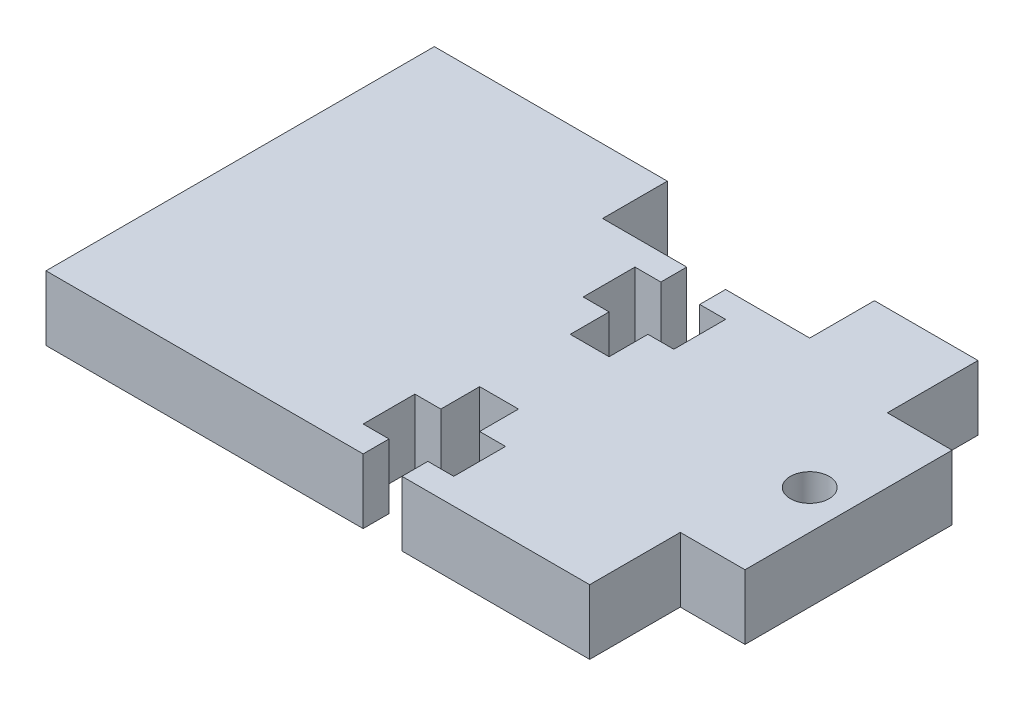
ISO-10303-21;
HEADER;
FILE_DESCRIPTION(('STEP AP214'),'2;1');
FILE_NAME('part.step','',(''),(''),'','','');
FILE_SCHEMA(('AUTOMOTIVE_DESIGN { 1 0 10303 214 1 1 1 1 }'));
ENDSEC;
DATA;
#1=APPLICATION_CONTEXT('core data for automotive mechanical design processes');
#2=APPLICATION_PROTOCOL_DEFINITION('international standard','automotive_design',2000,#1);
#3=PRODUCT_CONTEXT('',#1,'mechanical');
#4=PRODUCT('Part','Part','',(#3));
#5=PRODUCT_RELATED_PRODUCT_CATEGORY('part','',(#4));
#6=PRODUCT_DEFINITION_FORMATION('','',#4);
#7=PRODUCT_DEFINITION_CONTEXT('part definition',#1,'design');
#8=PRODUCT_DEFINITION('design','',#6,#7);
#9=PRODUCT_DEFINITION_SHAPE('','',#8);
#10=(LENGTH_UNIT() NAMED_UNIT(*) SI_UNIT(.MILLI.,.METRE.));
#11=(NAMED_UNIT(*) PLANE_ANGLE_UNIT() SI_UNIT($,.RADIAN.));
#12=(NAMED_UNIT(*) SI_UNIT($,.STERADIAN.) SOLID_ANGLE_UNIT());
#13=UNCERTAINTY_MEASURE_WITH_UNIT(LENGTH_MEASURE(1.E-05),#10,'distance_accuracy_value','');
#14=(GEOMETRIC_REPRESENTATION_CONTEXT(3) GLOBAL_UNCERTAINTY_ASSIGNED_CONTEXT((#13)) GLOBAL_UNIT_ASSIGNED_CONTEXT((#10,
#11,#12)) REPRESENTATION_CONTEXT('',''));
#15=CARTESIAN_POINT('',(0.,0.,0.));
#16=DIRECTION('',(0.,0.,1.));
#17=DIRECTION('',(1.,0.,0.));
#18=AXIS2_PLACEMENT_3D('',#15,#16,#17);
#19=CARTESIAN_POINT('',(16.,5.,15.));
#20=DIRECTION('',(-1.,0.,0.));
#21=DIRECTION('',(0.,0.,1.));
#22=AXIS2_PLACEMENT_3D('',#19,#20,#21);
#23=PLANE('',#22);
#24=DIRECTION('',(0.,0.,-1.));
#25=VECTOR('',#24,1.);
#26=CARTESIAN_POINT('',(16.,5.,15.));
#27=LINE('',#26,#25);
#28=CARTESIAN_POINT('',(16.,5.,-8.));
#29=VERTEX_POINT('',#28);
#30=CARTESIAN_POINT('',(16.,5.,-15.));
#31=VERTEX_POINT('',#30);
#32=EDGE_CURVE('E55',#29,#31,#27,.T.);
#33=ORIENTED_EDGE('',*,*,#32,.F.);
#34=DIRECTION('',(0.,-1.,0.));
#35=VECTOR('',#34,1.);
#36=CARTESIAN_POINT('',(16.,5.,-8.00000000000001));
#37=LINE('',#36,#35);
#38=CARTESIAN_POINT('',(16.,0.,-8.00000000000001));
#39=VERTEX_POINT('',#38);
#40=EDGE_CURVE('E334',#29,#39,#37,.T.);
#41=ORIENTED_EDGE('',*,*,#40,.T.);
#42=DIRECTION('',(0.,0.,-1.));
#43=VECTOR('',#42,1.);
#44=CARTESIAN_POINT('',(16.,0.,15.));
#45=LINE('',#44,#43);
#46=CARTESIAN_POINT('',(16.,0.,-15.));
#47=VERTEX_POINT('',#46);
#48=EDGE_CURVE('E557',#39,#47,#45,.T.);
#49=ORIENTED_EDGE('',*,*,#48,.T.);
#50=DIRECTION('',(0.,-1.,0.));
#51=VECTOR('',#50,1.);
#52=CARTESIAN_POINT('',(16.,5.,-15.));
#53=LINE('',#52,#51);
#54=EDGE_CURVE('E48',#31,#47,#53,.T.);
#55=ORIENTED_EDGE('',*,*,#54,.F.);
#56=EDGE_LOOP('',(#33,#41,#49,#55));
#57=FACE_BOUND('',#56,.T.);
#58=ADVANCED_FACE('F40',(#57),#23,.F.);
#59=CARTESIAN_POINT('',(16.,5.,15.));
#60=DIRECTION('',(0.,0.,-1.));
#61=DIRECTION('',(-1.,0.,0.));
#62=AXIS2_PLACEMENT_3D('',#59,#60,#61);
#63=PLANE('',#62);
#64=DIRECTION('',(1.,0.,0.));
#65=VECTOR('',#64,1.);
#66=CARTESIAN_POINT('',(16.,0.,15.));
#67=LINE('',#66,#65);
#68=CARTESIAN_POINT('',(-26.,0.,15.));
#69=VERTEX_POINT('',#68);
#70=CARTESIAN_POINT('',(-1.5,0.,15.));
#71=VERTEX_POINT('',#70);
#72=EDGE_CURVE('E301',#69,#71,#67,.T.);
#73=ORIENTED_EDGE('',*,*,#72,.T.);
#74=DIRECTION('',(0.,1.,0.));
#75=VECTOR('',#74,1.);
#76=CARTESIAN_POINT('',(-1.5,0.,15.));
#77=LINE('',#76,#75);
#78=CARTESIAN_POINT('',(-1.5,5.,15.));
#79=VERTEX_POINT('',#78);
#80=EDGE_CURVE('E401',#71,#79,#77,.T.);
#81=ORIENTED_EDGE('',*,*,#80,.T.);
#82=DIRECTION('',(1.,0.,0.));
#83=VECTOR('',#82,1.);
#84=CARTESIAN_POINT('',(16.,5.,15.));
#85=LINE('',#84,#83);
#86=CARTESIAN_POINT('',(-26.,5.,15.));
#87=VERTEX_POINT('',#86);
#88=EDGE_CURVE('E546',#87,#79,#85,.T.);
#89=ORIENTED_EDGE('',*,*,#88,.F.);
#90=DIRECTION('',(0.,1.,0.));
#91=VECTOR('',#90,1.);
#92=CARTESIAN_POINT('',(-26.,0.,15.));
#93=LINE('',#92,#91);
#94=EDGE_CURVE('E296',#69,#87,#93,.T.);
#95=ORIENTED_EDGE('',*,*,#94,.F.);
#96=EDGE_LOOP('',(#73,#81,#89,#95));
#97=FACE_BOUND('',#96,.T.);
#98=ADVANCED_FACE('F579',(#97),#63,.F.);
#99=CARTESIAN_POINT('',(16.,5.,-15.));
#100=DIRECTION('',(0.,0.,1.));
#101=DIRECTION('',(1.,0.,0.));
#102=AXIS2_PLACEMENT_3D('',#99,#100,#101);
#103=PLANE('',#102);
#104=DIRECTION('',(-1.,0.,0.));
#105=VECTOR('',#104,1.);
#106=CARTESIAN_POINT('',(16.,5.,-15.));
#107=LINE('',#106,#105);
#108=CARTESIAN_POINT('',(-8.,5.,-15.));
#109=VERTEX_POINT('',#108);
#110=CARTESIAN_POINT('',(-26.,5.,-15.));
#111=VERTEX_POINT('',#110);
#112=EDGE_CURVE('E552',#109,#111,#107,.T.);
#113=ORIENTED_EDGE('',*,*,#112,.F.);
#114=DIRECTION('',(0.,1.,0.));
#115=VECTOR('',#114,1.);
#116=CARTESIAN_POINT('',(-8.,0.,-15.));
#117=LINE('',#116,#115);
#118=CARTESIAN_POINT('',(-8.,0.,-15.));
#119=VERTEX_POINT('',#118);
#120=EDGE_CURVE('E282',#119,#109,#117,.T.);
#121=ORIENTED_EDGE('',*,*,#120,.F.);
#122=DIRECTION('',(-1.,0.,0.));
#123=VECTOR('',#122,1.);
#124=CARTESIAN_POINT('',(16.,0.,-15.));
#125=LINE('',#124,#123);
#126=CARTESIAN_POINT('',(-26.,0.,-15.));
#127=VERTEX_POINT('',#126);
#128=EDGE_CURVE('E276',#119,#127,#125,.T.);
#129=ORIENTED_EDGE('',*,*,#128,.T.);
#130=DIRECTION('',(0.,1.,0.));
#131=VECTOR('',#130,1.);
#132=CARTESIAN_POINT('',(-26.,0.,-15.));
#133=LINE('',#132,#131);
#134=EDGE_CURVE('E280',#127,#111,#133,.T.);
#135=ORIENTED_EDGE('',*,*,#134,.T.);
#136=EDGE_LOOP('',(#113,#121,#129,#135));
#137=FACE_BOUND('',#136,.T.);
#138=ADVANCED_FACE('F279',(#137),#103,.F.);
#139=CARTESIAN_POINT('',(1.5,5.,15.));
#140=VERTEX_POINT('',#139);
#141=CARTESIAN_POINT('',(16.,5.,15.));
#142=VERTEX_POINT('',#141);
#143=EDGE_CURVE('E549',#140,#142,#85,.T.);
#144=ORIENTED_EDGE('',*,*,#143,.F.);
#145=DIRECTION('',(0.,1.,0.));
#146=VECTOR('',#145,1.);
#147=CARTESIAN_POINT('',(1.5,0.,15.));
#148=LINE('',#147,#146);
#149=CARTESIAN_POINT('',(1.5,0.,15.));
#150=VERTEX_POINT('',#149);
#151=EDGE_CURVE('E370',#150,#140,#148,.T.);
#152=ORIENTED_EDGE('',*,*,#151,.F.);
#153=CARTESIAN_POINT('',(16.,0.,15.));
#154=VERTEX_POINT('',#153);
#155=EDGE_CURVE('E516',#150,#154,#67,.T.);
#156=ORIENTED_EDGE('',*,*,#155,.T.);
#157=DIRECTION('',(0.,-1.,0.));
#158=VECTOR('',#157,1.);
#159=CARTESIAN_POINT('',(16.,5.,15.));
#160=LINE('',#159,#158);
#161=EDGE_CURVE('E11',#142,#154,#160,.T.);
#162=ORIENTED_EDGE('',*,*,#161,.F.);
#163=EDGE_LOOP('',(#144,#152,#156,#162));
#164=FACE_BOUND('',#163,.T.);
#165=ADVANCED_FACE('F42',(#164),#63,.F.);
#166=CARTESIAN_POINT('',(16.,0.,8.));
#167=VERTEX_POINT('',#166);
#168=EDGE_CURVE('E287',#154,#167,#45,.T.);
#169=ORIENTED_EDGE('',*,*,#168,.T.);
#170=DIRECTION('',(0.,1.,0.));
#171=VECTOR('',#170,1.);
#172=CARTESIAN_POINT('',(16.,5.,8.));
#173=LINE('',#172,#171);
#174=CARTESIAN_POINT('',(16.,5.,8.));
#175=VERTEX_POINT('',#174);
#176=EDGE_CURVE('E63',#167,#175,#173,.T.);
#177=ORIENTED_EDGE('',*,*,#176,.T.);
#178=EDGE_CURVE('E550',#142,#175,#27,.T.);
#179=ORIENTED_EDGE('',*,*,#178,.F.);
#180=ORIENTED_EDGE('',*,*,#161,.T.);
#181=EDGE_LOOP('',(#169,#177,#179,#180));
#182=FACE_BOUND('',#181,.T.);
#183=ADVANCED_FACE('F580',(#182),#23,.F.);
#184=CARTESIAN_POINT('',(8.,0.,-15.));
#185=VERTEX_POINT('',#184);
#186=EDGE_CURVE('E286',#47,#185,#125,.T.);
#187=ORIENTED_EDGE('',*,*,#186,.T.);
#188=DIRECTION('',(0.,1.,0.));
#189=VECTOR('',#188,1.);
#190=CARTESIAN_POINT('',(8.,0.,-15.));
#191=LINE('',#190,#189);
#192=CARTESIAN_POINT('',(8.,5.,-15.));
#193=VERTEX_POINT('',#192);
#194=EDGE_CURVE('E542',#185,#193,#191,.T.);
#195=ORIENTED_EDGE('',*,*,#194,.T.);
#196=EDGE_CURVE('E553',#31,#193,#107,.T.);
#197=ORIENTED_EDGE('',*,*,#196,.F.);
#198=ORIENTED_EDGE('',*,*,#54,.T.);
#199=EDGE_LOOP('',(#187,#195,#197,#198));
#200=FACE_BOUND('',#199,.T.);
#201=ADVANCED_FACE('F563',(#200),#103,.F.);
#202=CARTESIAN_POINT('',(0.,5.,0.));
#203=DIRECTION('',(0.,1.,0.));
#204=DIRECTION('',(0.,0.,1.));
#205=AXIS2_PLACEMENT_3D('',#202,#203,#204);
#206=PLANE('',#205);
#207=CARTESIAN_POINT('',(18.,5.,0.));
#208=DIRECTION('',(0.,1.,0.));
#209=DIRECTION('',(0.,0.,1.));
#210=AXIS2_PLACEMENT_3D('',#207,#208,#209);
#211=CIRCLE('',#210,1.5);
#212=CARTESIAN_POINT('',(18.,5.,1.5));
#213=VERTEX_POINT('',#212);
#214=EDGE_CURVE('E306',#213,#213,#211,.T.);
#215=ORIENTED_EDGE('',*,*,#214,.F.);
#216=EDGE_LOOP('',(#215));
#217=FACE_BOUND('',#216,.T.);
#218=ORIENTED_EDGE('',*,*,#178,.T.);
#219=DIRECTION('',(1.,0.,0.));
#220=VECTOR('',#219,1.);
#221=CARTESIAN_POINT('',(21.,5.,8.));
#222=LINE('',#221,#220);
#223=CARTESIAN_POINT('',(21.,5.,8.));
#224=VERTEX_POINT('',#223);
#225=EDGE_CURVE('E311',#175,#224,#222,.T.);
#226=ORIENTED_EDGE('',*,*,#225,.T.);
#227=DIRECTION('',(0.,0.,-1.));
#228=VECTOR('',#227,1.);
#229=CARTESIAN_POINT('',(21.,5.,8.));
#230=LINE('',#229,#228);
#231=CARTESIAN_POINT('',(21.,5.,-8.00000000000001));
#232=VERTEX_POINT('',#231);
#233=EDGE_CURVE('E321',#224,#232,#230,.T.);
#234=ORIENTED_EDGE('',*,*,#233,.T.);
#235=DIRECTION('',(-1.,0.,0.));
#236=VECTOR('',#235,1.);
#237=CARTESIAN_POINT('',(21.,5.,-8.00000000000001));
#238=LINE('',#237,#236);
#239=EDGE_CURVE('E324',#232,#29,#238,.T.);
#240=ORIENTED_EDGE('',*,*,#239,.T.);
#241=ORIENTED_EDGE('',*,*,#32,.T.);
#242=ORIENTED_EDGE('',*,*,#196,.T.);
#243=DIRECTION('',(0.,0.,-1.));
#244=VECTOR('',#243,1.);
#245=CARTESIAN_POINT('',(8.,5.,-15.));
#246=LINE('',#245,#244);
#247=CARTESIAN_POINT('',(8.,5.,-10.));
#248=VERTEX_POINT('',#247);
#249=EDGE_CURVE('E474',#248,#193,#246,.T.);
#250=ORIENTED_EDGE('',*,*,#249,.F.);
#251=DIRECTION('',(1.,0.,0.));
#252=VECTOR('',#251,1.);
#253=CARTESIAN_POINT('',(8.,5.,-10.));
#254=LINE('',#253,#252);
#255=CARTESIAN_POINT('',(1.5,5.,-10.));
#256=VERTEX_POINT('',#255);
#257=EDGE_CURVE('E404',#256,#248,#254,.T.);
#258=ORIENTED_EDGE('',*,*,#257,.F.);
#259=DIRECTION('',(0.,0.,-1.));
#260=VECTOR('',#259,1.);
#261=CARTESIAN_POINT('',(1.5,5.,-10.));
#262=LINE('',#261,#260);
#263=CARTESIAN_POINT('',(1.5,5.,-8.));
#264=VERTEX_POINT('',#263);
#265=EDGE_CURVE('E430',#264,#256,#262,.T.);
#266=ORIENTED_EDGE('',*,*,#265,.F.);
#267=DIRECTION('',(-1.,0.,0.));
#268=VECTOR('',#267,1.);
#269=CARTESIAN_POINT('',(1.5,5.,-8.));
#270=LINE('',#269,#268);
#271=CARTESIAN_POINT('',(3.5,5.,-8.));
#272=VERTEX_POINT('',#271);
#273=EDGE_CURVE('E509',#272,#264,#270,.T.);
#274=ORIENTED_EDGE('',*,*,#273,.F.);
#275=DIRECTION('',(0.,0.,-1.));
#276=VECTOR('',#275,1.);
#277=CARTESIAN_POINT('',(3.5,5.,-8.));
#278=LINE('',#277,#276);
#279=CARTESIAN_POINT('',(3.5,5.,-4.));
#280=VERTEX_POINT('',#279);
#281=EDGE_CURVE('E506',#280,#272,#278,.T.);
#282=ORIENTED_EDGE('',*,*,#281,.F.);
#283=DIRECTION('',(1.,0.,0.));
#284=VECTOR('',#283,1.);
#285=CARTESIAN_POINT('',(3.5,5.,-4.));
#286=LINE('',#285,#284);
#287=CARTESIAN_POINT('',(1.5,5.,-4.));
#288=VERTEX_POINT('',#287);
#289=EDGE_CURVE('E503',#288,#280,#286,.T.);
#290=ORIENTED_EDGE('',*,*,#289,.F.);
#291=DIRECTION('',(0.,0.,-1.));
#292=VECTOR('',#291,1.);
#293=CARTESIAN_POINT('',(1.5,5.,-4.));
#294=LINE('',#293,#292);
#295=CARTESIAN_POINT('',(1.5,5.,-1.));
#296=VERTEX_POINT('',#295);
#297=EDGE_CURVE('E500',#296,#288,#294,.T.);
#298=ORIENTED_EDGE('',*,*,#297,.F.);
#299=DIRECTION('',(1.,0.,0.));
#300=VECTOR('',#299,1.);
#301=CARTESIAN_POINT('',(1.5,5.,-1.));
#302=LINE('',#301,#300);
#303=CARTESIAN_POINT('',(-1.5,5.,-1.));
#304=VERTEX_POINT('',#303);
#305=EDGE_CURVE('E497',#304,#296,#302,.T.);
#306=ORIENTED_EDGE('',*,*,#305,.F.);
#307=DIRECTION('',(0.,0.,1.));
#308=VECTOR('',#307,1.);
#309=CARTESIAN_POINT('',(-1.5,5.,-4.));
#310=LINE('',#309,#308);
#311=CARTESIAN_POINT('',(-1.5,5.,-4.));
#312=VERTEX_POINT('',#311);
#313=EDGE_CURVE('E494',#312,#304,#310,.T.);
#314=ORIENTED_EDGE('',*,*,#313,.F.);
#315=DIRECTION('',(1.,0.,0.));
#316=VECTOR('',#315,1.);
#317=CARTESIAN_POINT('',(-3.5,5.,-4.));
#318=LINE('',#317,#316);
#319=CARTESIAN_POINT('',(-3.5,5.,-4.));
#320=VERTEX_POINT('',#319);
#321=EDGE_CURVE('E491',#320,#312,#318,.T.);
#322=ORIENTED_EDGE('',*,*,#321,.F.);
#323=DIRECTION('',(0.,0.,1.));
#324=VECTOR('',#323,1.);
#325=CARTESIAN_POINT('',(-3.5,5.,-8.));
#326=LINE('',#325,#324);
#327=CARTESIAN_POINT('',(-3.5,5.,-8.));
#328=VERTEX_POINT('',#327);
#329=EDGE_CURVE('E488',#328,#320,#326,.T.);
#330=ORIENTED_EDGE('',*,*,#329,.F.);
#331=DIRECTION('',(-1.,0.,0.));
#332=VECTOR('',#331,1.);
#333=CARTESIAN_POINT('',(-1.5,5.,-8.));
#334=LINE('',#333,#332);
#335=CARTESIAN_POINT('',(-1.5,5.,-8.));
#336=VERTEX_POINT('',#335);
#337=EDGE_CURVE('E485',#336,#328,#334,.T.);
#338=ORIENTED_EDGE('',*,*,#337,.F.);
#339=DIRECTION('',(0.,0.,1.));
#340=VECTOR('',#339,1.);
#341=CARTESIAN_POINT('',(-1.5,5.,-10.));
#342=LINE('',#341,#340);
#343=CARTESIAN_POINT('',(-1.5,5.,-10.));
#344=VERTEX_POINT('',#343);
#345=EDGE_CURVE('E482',#344,#336,#342,.T.);
#346=ORIENTED_EDGE('',*,*,#345,.F.);
#347=DIRECTION('',(1.,0.,0.));
#348=VECTOR('',#347,1.);
#349=CARTESIAN_POINT('',(-8.,5.,-10.));
#350=LINE('',#349,#348);
#351=CARTESIAN_POINT('',(-8.,5.,-10.));
#352=VERTEX_POINT('',#351);
#353=EDGE_CURVE('E479',#352,#344,#350,.T.);
#354=ORIENTED_EDGE('',*,*,#353,.F.);
#355=DIRECTION('',(0.,0.,1.));
#356=VECTOR('',#355,1.);
#357=CARTESIAN_POINT('',(-8.,5.,-15.));
#358=LINE('',#357,#356);
#359=EDGE_CURVE('E476',#109,#352,#358,.T.);
#360=ORIENTED_EDGE('',*,*,#359,.F.);
#361=ORIENTED_EDGE('',*,*,#112,.T.);
#362=DIRECTION('',(0.,0.,1.));
#363=VECTOR('',#362,1.);
#364=CARTESIAN_POINT('',(-26.,5.,-15.));
#365=LINE('',#364,#363);
#366=EDGE_CURVE('E295',#111,#87,#365,.T.);
#367=ORIENTED_EDGE('',*,*,#366,.T.);
#368=ORIENTED_EDGE('',*,*,#88,.T.);
#369=DIRECTION('',(0.,0.,1.));
#370=VECTOR('',#369,1.);
#371=CARTESIAN_POINT('',(-1.5,5.,15.));
#372=LINE('',#371,#370);
#373=CARTESIAN_POINT('',(-1.5,5.,13.));
#374=VERTEX_POINT('',#373);
#375=EDGE_CURVE('E341',#374,#79,#372,.T.);
#376=ORIENTED_EDGE('',*,*,#375,.F.);
#377=DIRECTION('',(1.,0.,0.));
#378=VECTOR('',#377,1.);
#379=CARTESIAN_POINT('',(-1.5,5.,13.));
#380=LINE('',#379,#378);
#381=CARTESIAN_POINT('',(-3.5,5.,13.));
#382=VERTEX_POINT('',#381);
#383=EDGE_CURVE('E397',#382,#374,#380,.T.);
#384=ORIENTED_EDGE('',*,*,#383,.F.);
#385=DIRECTION('',(0.,0.,1.));
#386=VECTOR('',#385,1.);
#387=CARTESIAN_POINT('',(-3.5,5.,13.));
#388=LINE('',#387,#386);
#389=CARTESIAN_POINT('',(-3.5,5.,8.99999999999999));
#390=VERTEX_POINT('',#389);
#391=EDGE_CURVE('E394',#390,#382,#388,.T.);
#392=ORIENTED_EDGE('',*,*,#391,.F.);
#393=DIRECTION('',(-1.,0.,0.));
#394=VECTOR('',#393,1.);
#395=CARTESIAN_POINT('',(-3.5,5.,8.99999999999999));
#396=LINE('',#395,#394);
#397=CARTESIAN_POINT('',(-1.5,5.,8.99999999999999));
#398=VERTEX_POINT('',#397);
#399=EDGE_CURVE('E391',#398,#390,#396,.T.);
#400=ORIENTED_EDGE('',*,*,#399,.F.);
#401=DIRECTION('',(0.,0.,1.));
#402=VECTOR('',#401,1.);
#403=CARTESIAN_POINT('',(-1.5,5.,8.99999999999999));
#404=LINE('',#403,#402);
#405=CARTESIAN_POINT('',(-1.5,5.,5.99999999999999));
#406=VERTEX_POINT('',#405);
#407=EDGE_CURVE('E388',#406,#398,#404,.T.);
#408=ORIENTED_EDGE('',*,*,#407,.F.);
#409=DIRECTION('',(-1.,0.,0.));
#410=VECTOR('',#409,1.);
#411=CARTESIAN_POINT('',(1.5,5.,5.99999999999999));
#412=LINE('',#411,#410);
#413=CARTESIAN_POINT('',(1.5,5.,5.99999999999999));
#414=VERTEX_POINT('',#413);
#415=EDGE_CURVE('E385',#414,#406,#412,.T.);
#416=ORIENTED_EDGE('',*,*,#415,.F.);
#417=DIRECTION('',(0.,0.,-1.));
#418=VECTOR('',#417,1.);
#419=CARTESIAN_POINT('',(1.5,5.,8.99999999999999));
#420=LINE('',#419,#418);
#421=CARTESIAN_POINT('',(1.5,5.,8.99999999999999));
#422=VERTEX_POINT('',#421);
#423=EDGE_CURVE('E382',#422,#414,#420,.T.);
#424=ORIENTED_EDGE('',*,*,#423,.F.);
#425=DIRECTION('',(-1.,0.,0.));
#426=VECTOR('',#425,1.);
#427=CARTESIAN_POINT('',(3.5,5.,8.99999999999999));
#428=LINE('',#427,#426);
#429=CARTESIAN_POINT('',(3.5,5.,8.99999999999999));
#430=VERTEX_POINT('',#429);
#431=EDGE_CURVE('E379',#430,#422,#428,.T.);
#432=ORIENTED_EDGE('',*,*,#431,.F.);
#433=DIRECTION('',(0.,0.,-1.));
#434=VECTOR('',#433,1.);
#435=CARTESIAN_POINT('',(3.5,5.,13.));
#436=LINE('',#435,#434);
#437=CARTESIAN_POINT('',(3.5,5.,13.));
#438=VERTEX_POINT('',#437);
#439=EDGE_CURVE('E376',#438,#430,#436,.T.);
#440=ORIENTED_EDGE('',*,*,#439,.F.);
#441=DIRECTION('',(1.,0.,0.));
#442=VECTOR('',#441,1.);
#443=CARTESIAN_POINT('',(1.5,5.,13.));
#444=LINE('',#443,#442);
#445=CARTESIAN_POINT('',(1.5,5.,13.));
#446=VERTEX_POINT('',#445);
#447=EDGE_CURVE('E373',#446,#438,#444,.T.);
#448=ORIENTED_EDGE('',*,*,#447,.F.);
#449=DIRECTION('',(0.,0.,-1.));
#450=VECTOR('',#449,1.);
#451=CARTESIAN_POINT('',(1.5,5.,15.));
#452=LINE('',#451,#450);
#453=EDGE_CURVE('E336',#140,#446,#452,.T.);
#454=ORIENTED_EDGE('',*,*,#453,.F.);
#455=ORIENTED_EDGE('',*,*,#143,.T.);
#456=EDGE_LOOP('',(#218,#226,#234,#240,#241,#242,#250,#258,#266,#274,#282,#290,#298,#306,#314,
#322,#330,#338,#346,#354,#360,#361,#367,#368,#376,#384,#392,#400,#408,#416,#424,#432,#440,#448,
#454,#455));
#457=FACE_BOUND('',#456,.T.);
#458=ADVANCED_FACE('F570',(#217,#457),#206,.T.);
#459=CARTESIAN_POINT('',(0.,0.,0.));
#460=DIRECTION('',(0.,1.,0.));
#461=DIRECTION('',(0.,0.,1.));
#462=AXIS2_PLACEMENT_3D('',#459,#460,#461);
#463=PLANE('',#462);
#464=CARTESIAN_POINT('',(18.,0.,0.));
#465=DIRECTION('',(0.,1.,0.));
#466=DIRECTION('',(0.,0.,1.));
#467=AXIS2_PLACEMENT_3D('',#464,#465,#466);
#468=CIRCLE('',#467,1.5);
#469=CARTESIAN_POINT('',(18.,0.,1.5));
#470=VERTEX_POINT('',#469);
#471=EDGE_CURVE('E308',#470,#470,#468,.T.);
#472=ORIENTED_EDGE('',*,*,#471,.T.);
#473=EDGE_LOOP('',(#472));
#474=FACE_BOUND('',#473,.T.);
#475=ORIENTED_EDGE('',*,*,#48,.F.);
#476=DIRECTION('',(1.,0.,0.));
#477=VECTOR('',#476,1.);
#478=CARTESIAN_POINT('',(21.,0.,-8.00000000000001));
#479=LINE('',#478,#477);
#480=CARTESIAN_POINT('',(21.,0.,-8.));
#481=VERTEX_POINT('',#480);
#482=EDGE_CURVE('E316',#39,#481,#479,.T.);
#483=ORIENTED_EDGE('',*,*,#482,.T.);
#484=DIRECTION('',(0.,0.,1.));
#485=VECTOR('',#484,1.);
#486=CARTESIAN_POINT('',(21.,0.,8.));
#487=LINE('',#486,#485);
#488=CARTESIAN_POINT('',(21.,0.,8.));
#489=VERTEX_POINT('',#488);
#490=EDGE_CURVE('E314',#481,#489,#487,.T.);
#491=ORIENTED_EDGE('',*,*,#490,.T.);
#492=DIRECTION('',(-1.,0.,0.));
#493=VECTOR('',#492,1.);
#494=CARTESIAN_POINT('',(21.,0.,8.));
#495=LINE('',#494,#493);
#496=EDGE_CURVE('E319',#489,#167,#495,.T.);
#497=ORIENTED_EDGE('',*,*,#496,.T.);
#498=ORIENTED_EDGE('',*,*,#168,.F.);
#499=ORIENTED_EDGE('',*,*,#155,.F.);
#500=DIRECTION('',(0.,0.,-1.));
#501=VECTOR('',#500,1.);
#502=CARTESIAN_POINT('',(1.5,0.,15.));
#503=LINE('',#502,#501);
#504=CARTESIAN_POINT('',(1.5,0.,13.));
#505=VERTEX_POINT('',#504);
#506=EDGE_CURVE('E337',#150,#505,#503,.T.);
#507=ORIENTED_EDGE('',*,*,#506,.T.);
#508=DIRECTION('',(1.,0.,0.));
#509=VECTOR('',#508,1.);
#510=CARTESIAN_POINT('',(1.5,0.,13.));
#511=LINE('',#510,#509);
#512=CARTESIAN_POINT('',(3.5,0.,13.));
#513=VERTEX_POINT('',#512);
#514=EDGE_CURVE('E340',#505,#513,#511,.T.);
#515=ORIENTED_EDGE('',*,*,#514,.T.);
#516=DIRECTION('',(0.,0.,-1.));
#517=VECTOR('',#516,1.);
#518=CARTESIAN_POINT('',(3.5,0.,13.));
#519=LINE('',#518,#517);
#520=CARTESIAN_POINT('',(3.5,0.,8.99999999999999));
#521=VERTEX_POINT('',#520);
#522=EDGE_CURVE('E344',#513,#521,#519,.T.);
#523=ORIENTED_EDGE('',*,*,#522,.T.);
#524=DIRECTION('',(-1.,0.,0.));
#525=VECTOR('',#524,1.);
#526=CARTESIAN_POINT('',(3.5,0.,8.99999999999999));
#527=LINE('',#526,#525);
#528=CARTESIAN_POINT('',(1.5,0.,8.99999999999999));
#529=VERTEX_POINT('',#528);
#530=EDGE_CURVE('E347',#521,#529,#527,.T.);
#531=ORIENTED_EDGE('',*,*,#530,.T.);
#532=DIRECTION('',(0.,0.,-1.));
#533=VECTOR('',#532,1.);
#534=CARTESIAN_POINT('',(1.5,0.,8.99999999999999));
#535=LINE('',#534,#533);
#536=CARTESIAN_POINT('',(1.5,0.,5.99999999999999));
#537=VERTEX_POINT('',#536);
#538=EDGE_CURVE('E350',#529,#537,#535,.T.);
#539=ORIENTED_EDGE('',*,*,#538,.T.);
#540=DIRECTION('',(-1.,0.,0.));
#541=VECTOR('',#540,1.);
#542=CARTESIAN_POINT('',(1.5,0.,5.99999999999999));
#543=LINE('',#542,#541);
#544=CARTESIAN_POINT('',(-1.5,0.,5.99999999999999));
#545=VERTEX_POINT('',#544);
#546=EDGE_CURVE('E353',#537,#545,#543,.T.);
#547=ORIENTED_EDGE('',*,*,#546,.T.);
#548=DIRECTION('',(0.,0.,1.));
#549=VECTOR('',#548,1.);
#550=CARTESIAN_POINT('',(-1.5,0.,8.99999999999999));
#551=LINE('',#550,#549);
#552=CARTESIAN_POINT('',(-1.5,0.,8.99999999999999));
#553=VERTEX_POINT('',#552);
#554=EDGE_CURVE('E356',#545,#553,#551,.T.);
#555=ORIENTED_EDGE('',*,*,#554,.T.);
#556=DIRECTION('',(-1.,0.,0.));
#557=VECTOR('',#556,1.);
#558=CARTESIAN_POINT('',(-3.5,0.,8.99999999999999));
#559=LINE('',#558,#557);
#560=CARTESIAN_POINT('',(-3.5,0.,8.99999999999999));
#561=VERTEX_POINT('',#560);
#562=EDGE_CURVE('E359',#553,#561,#559,.T.);
#563=ORIENTED_EDGE('',*,*,#562,.T.);
#564=DIRECTION('',(0.,0.,1.));
#565=VECTOR('',#564,1.);
#566=CARTESIAN_POINT('',(-3.5,0.,13.));
#567=LINE('',#566,#565);
#568=CARTESIAN_POINT('',(-3.5,0.,13.));
#569=VERTEX_POINT('',#568);
#570=EDGE_CURVE('E362',#561,#569,#567,.T.);
#571=ORIENTED_EDGE('',*,*,#570,.T.);
#572=DIRECTION('',(1.,0.,0.));
#573=VECTOR('',#572,1.);
#574=CARTESIAN_POINT('',(-1.5,0.,13.));
#575=LINE('',#574,#573);
#576=CARTESIAN_POINT('',(-1.5,0.,13.));
#577=VERTEX_POINT('',#576);
#578=EDGE_CURVE('E365',#569,#577,#575,.T.);
#579=ORIENTED_EDGE('',*,*,#578,.T.);
#580=DIRECTION('',(0.,0.,1.));
#581=VECTOR('',#580,1.);
#582=CARTESIAN_POINT('',(-1.5,0.,15.));
#583=LINE('',#582,#581);
#584=EDGE_CURVE('E368',#577,#71,#583,.T.);
#585=ORIENTED_EDGE('',*,*,#584,.T.);
#586=ORIENTED_EDGE('',*,*,#72,.F.);
#587=DIRECTION('',(0.,0.,1.));
#588=VECTOR('',#587,1.);
#589=CARTESIAN_POINT('',(-26.,0.,-15.));
#590=LINE('',#589,#588);
#591=EDGE_CURVE('E293',#127,#69,#590,.T.);
#592=ORIENTED_EDGE('',*,*,#591,.F.);
#593=ORIENTED_EDGE('',*,*,#128,.F.);
#594=DIRECTION('',(0.,0.,1.));
#595=VECTOR('',#594,1.);
#596=CARTESIAN_POINT('',(-8.,0.,-15.));
#597=LINE('',#596,#595);
#598=CARTESIAN_POINT('',(-8.,0.,-10.));
#599=VERTEX_POINT('',#598);
#600=EDGE_CURVE('E433',#119,#599,#597,.T.);
#601=ORIENTED_EDGE('',*,*,#600,.T.);
#602=DIRECTION('',(1.,0.,0.));
#603=VECTOR('',#602,1.);
#604=CARTESIAN_POINT('',(-8.,0.,-10.));
#605=LINE('',#604,#603);
#606=CARTESIAN_POINT('',(-1.5,0.,-10.));
#607=VERTEX_POINT('',#606);
#608=EDGE_CURVE('E435',#599,#607,#605,.T.);
#609=ORIENTED_EDGE('',*,*,#608,.T.);
#610=DIRECTION('',(0.,0.,1.));
#611=VECTOR('',#610,1.);
#612=CARTESIAN_POINT('',(-1.5,0.,-10.));
#613=LINE('',#612,#611);
#614=CARTESIAN_POINT('',(-1.5,0.,-8.));
#615=VERTEX_POINT('',#614);
#616=EDGE_CURVE('E438',#607,#615,#613,.T.);
#617=ORIENTED_EDGE('',*,*,#616,.T.);
#618=DIRECTION('',(-1.,0.,0.));
#619=VECTOR('',#618,1.);
#620=CARTESIAN_POINT('',(-1.5,0.,-8.));
#621=LINE('',#620,#619);
#622=CARTESIAN_POINT('',(-3.5,0.,-8.));
#623=VERTEX_POINT('',#622);
#624=EDGE_CURVE('E441',#615,#623,#621,.T.);
#625=ORIENTED_EDGE('',*,*,#624,.T.);
#626=DIRECTION('',(0.,0.,1.));
#627=VECTOR('',#626,1.);
#628=CARTESIAN_POINT('',(-3.5,0.,-8.));
#629=LINE('',#628,#627);
#630=CARTESIAN_POINT('',(-3.5,0.,-4.));
#631=VERTEX_POINT('',#630);
#632=EDGE_CURVE('E444',#623,#631,#629,.T.);
#633=ORIENTED_EDGE('',*,*,#632,.T.);
#634=DIRECTION('',(1.,0.,0.));
#635=VECTOR('',#634,1.);
#636=CARTESIAN_POINT('',(-3.5,0.,-4.));
#637=LINE('',#636,#635);
#638=CARTESIAN_POINT('',(-1.5,0.,-4.));
#639=VERTEX_POINT('',#638);
#640=EDGE_CURVE('E447',#631,#639,#637,.T.);
#641=ORIENTED_EDGE('',*,*,#640,.T.);
#642=DIRECTION('',(0.,0.,1.));
#643=VECTOR('',#642,1.);
#644=CARTESIAN_POINT('',(-1.5,0.,-4.));
#645=LINE('',#644,#643);
#646=CARTESIAN_POINT('',(-1.5,0.,-1.));
#647=VERTEX_POINT('',#646);
#648=EDGE_CURVE('E450',#639,#647,#645,.T.);
#649=ORIENTED_EDGE('',*,*,#648,.T.);
#650=DIRECTION('',(1.,0.,0.));
#651=VECTOR('',#650,1.);
#652=CARTESIAN_POINT('',(1.5,0.,-1.));
#653=LINE('',#652,#651);
#654=CARTESIAN_POINT('',(1.5,0.,-1.));
#655=VERTEX_POINT('',#654);
#656=EDGE_CURVE('E453',#647,#655,#653,.T.);
#657=ORIENTED_EDGE('',*,*,#656,.T.);
#658=DIRECTION('',(0.,0.,-1.));
#659=VECTOR('',#658,1.);
#660=CARTESIAN_POINT('',(1.5,0.,-4.));
#661=LINE('',#660,#659);
#662=CARTESIAN_POINT('',(1.5,0.,-4.));
#663=VERTEX_POINT('',#662);
#664=EDGE_CURVE('E456',#655,#663,#661,.T.);
#665=ORIENTED_EDGE('',*,*,#664,.T.);
#666=DIRECTION('',(1.,0.,0.));
#667=VECTOR('',#666,1.);
#668=CARTESIAN_POINT('',(3.5,0.,-4.));
#669=LINE('',#668,#667);
#670=CARTESIAN_POINT('',(3.5,0.,-4.));
#671=VERTEX_POINT('',#670);
#672=EDGE_CURVE('E459',#663,#671,#669,.T.);
#673=ORIENTED_EDGE('',*,*,#672,.T.);
#674=DIRECTION('',(0.,0.,-1.));
#675=VECTOR('',#674,1.);
#676=CARTESIAN_POINT('',(3.5,0.,-8.));
#677=LINE('',#676,#675);
#678=CARTESIAN_POINT('',(3.5,0.,-8.));
#679=VERTEX_POINT('',#678);
#680=EDGE_CURVE('E462',#671,#679,#677,.T.);
#681=ORIENTED_EDGE('',*,*,#680,.T.);
#682=DIRECTION('',(-1.,0.,0.));
#683=VECTOR('',#682,1.);
#684=CARTESIAN_POINT('',(1.5,0.,-8.));
#685=LINE('',#684,#683);
#686=CARTESIAN_POINT('',(1.5,0.,-8.));
#687=VERTEX_POINT('',#686);
#688=EDGE_CURVE('E465',#679,#687,#685,.T.);
#689=ORIENTED_EDGE('',*,*,#688,.T.);
#690=DIRECTION('',(0.,0.,-1.));
#691=VECTOR('',#690,1.);
#692=CARTESIAN_POINT('',(1.5,0.,-10.));
#693=LINE('',#692,#691);
#694=CARTESIAN_POINT('',(1.5,0.,-10.));
#695=VERTEX_POINT('',#694);
#696=EDGE_CURVE('E468',#687,#695,#693,.T.);
#697=ORIENTED_EDGE('',*,*,#696,.T.);
#698=DIRECTION('',(1.,0.,0.));
#699=VECTOR('',#698,1.);
#700=CARTESIAN_POINT('',(8.,0.,-10.));
#701=LINE('',#700,#699);
#702=CARTESIAN_POINT('',(8.,0.,-10.));
#703=VERTEX_POINT('',#702);
#704=EDGE_CURVE('E426',#695,#703,#701,.T.);
#705=ORIENTED_EDGE('',*,*,#704,.T.);
#706=DIRECTION('',(0.,0.,-1.));
#707=VECTOR('',#706,1.);
#708=CARTESIAN_POINT('',(8.,0.,-15.));
#709=LINE('',#708,#707);
#710=EDGE_CURVE('E429',#703,#185,#709,.T.);
#711=ORIENTED_EDGE('',*,*,#710,.T.);
#712=ORIENTED_EDGE('',*,*,#186,.F.);
#713=EDGE_LOOP('',(#475,#483,#491,#497,#498,#499,#507,#515,#523,#531,#539,#547,#555,#563,#571,
#579,#585,#586,#592,#593,#601,#609,#617,#625,#633,#641,#649,#657,#665,#673,#681,#689,#697,#705,
#711,#712));
#714=FACE_BOUND('',#713,.T.);
#715=ADVANCED_FACE('F298',(#474,#714),#463,.F.);
#716=CARTESIAN_POINT('',(8.,0.,-10.));
#717=DIRECTION('',(0.,0.,1.));
#718=DIRECTION('',(1.,0.,0.));
#719=AXIS2_PLACEMENT_3D('',#716,#717,#718);
#720=PLANE('',#719);
#721=ORIENTED_EDGE('',*,*,#257,.T.);
#722=DIRECTION('',(0.,1.,0.));
#723=VECTOR('',#722,1.);
#724=CARTESIAN_POINT('',(8.,0.,-10.));
#725=LINE('',#724,#723);
#726=EDGE_CURVE('E471',#703,#248,#725,.T.);
#727=ORIENTED_EDGE('',*,*,#726,.F.);
#728=ORIENTED_EDGE('',*,*,#704,.F.);
#729=DIRECTION('',(0.,1.,0.));
#730=VECTOR('',#729,1.);
#731=CARTESIAN_POINT('',(1.5,0.,-10.));
#732=LINE('',#731,#730);
#733=EDGE_CURVE('E514',#695,#256,#732,.T.);
#734=ORIENTED_EDGE('',*,*,#733,.T.);
#735=EDGE_LOOP('',(#721,#727,#728,#734));
#736=FACE_BOUND('',#735,.T.);
#737=ADVANCED_FACE('F663',(#736),#720,.F.);
#738=CARTESIAN_POINT('',(1.5,0.,-10.));
#739=DIRECTION('',(1.,0.,0.));
#740=DIRECTION('',(0.,0.,-1.));
#741=AXIS2_PLACEMENT_3D('',#738,#739,#740);
#742=PLANE('',#741);
#743=ORIENTED_EDGE('',*,*,#265,.T.);
#744=ORIENTED_EDGE('',*,*,#733,.F.);
#745=ORIENTED_EDGE('',*,*,#696,.F.);
#746=DIRECTION('',(0.,1.,0.));
#747=VECTOR('',#746,1.);
#748=CARTESIAN_POINT('',(1.5,0.,-8.));
#749=LINE('',#748,#747);
#750=EDGE_CURVE('E517',#687,#264,#749,.T.);
#751=ORIENTED_EDGE('',*,*,#750,.T.);
#752=EDGE_LOOP('',(#743,#744,#745,#751));
#753=FACE_BOUND('',#752,.T.);
#754=ADVANCED_FACE('F659',(#753),#742,.F.);
#755=CARTESIAN_POINT('',(1.5,0.,-8.));
#756=DIRECTION('',(0.,0.,-1.));
#757=DIRECTION('',(-1.,0.,0.));
#758=AXIS2_PLACEMENT_3D('',#755,#756,#757);
#759=PLANE('',#758);
#760=ORIENTED_EDGE('',*,*,#273,.T.);
#761=ORIENTED_EDGE('',*,*,#750,.F.);
#762=ORIENTED_EDGE('',*,*,#688,.F.);
#763=DIRECTION('',(0.,1.,0.));
#764=VECTOR('',#763,1.);
#765=CARTESIAN_POINT('',(3.5,0.,-8.));
#766=LINE('',#765,#764);
#767=EDGE_CURVE('E519',#679,#272,#766,.T.);
#768=ORIENTED_EDGE('',*,*,#767,.T.);
#769=EDGE_LOOP('',(#760,#761,#762,#768));
#770=FACE_BOUND('',#769,.T.);
#771=ADVANCED_FACE('F662',(#770),#759,.F.);
#772=CARTESIAN_POINT('',(3.5,0.,-8.));
#773=DIRECTION('',(1.,0.,0.));
#774=DIRECTION('',(0.,0.,-1.));
#775=AXIS2_PLACEMENT_3D('',#772,#773,#774);
#776=PLANE('',#775);
#777=ORIENTED_EDGE('',*,*,#281,.T.);
#778=ORIENTED_EDGE('',*,*,#767,.F.);
#779=ORIENTED_EDGE('',*,*,#680,.F.);
#780=DIRECTION('',(0.,1.,0.));
#781=VECTOR('',#780,1.);
#782=CARTESIAN_POINT('',(3.5,0.,-4.));
#783=LINE('',#782,#781);
#784=EDGE_CURVE('E521',#671,#280,#783,.T.);
#785=ORIENTED_EDGE('',*,*,#784,.T.);
#786=EDGE_LOOP('',(#777,#778,#779,#785));
#787=FACE_BOUND('',#786,.T.);
#788=ADVANCED_FACE('F667',(#787),#776,.F.);
#789=CARTESIAN_POINT('',(3.5,0.,-4.));
#790=DIRECTION('',(0.,0.,1.));
#791=DIRECTION('',(1.,0.,0.));
#792=AXIS2_PLACEMENT_3D('',#789,#790,#791);
#793=PLANE('',#792);
#794=ORIENTED_EDGE('',*,*,#289,.T.);
#795=ORIENTED_EDGE('',*,*,#784,.F.);
#796=ORIENTED_EDGE('',*,*,#672,.F.);
#797=DIRECTION('',(0.,1.,0.));
#798=VECTOR('',#797,1.);
#799=CARTESIAN_POINT('',(1.5,0.,-4.));
#800=LINE('',#799,#798);
#801=EDGE_CURVE('E523',#663,#288,#800,.T.);
#802=ORIENTED_EDGE('',*,*,#801,.T.);
#803=EDGE_LOOP('',(#794,#795,#796,#802));
#804=FACE_BOUND('',#803,.T.);
#805=ADVANCED_FACE('F671',(#804),#793,.F.);
#806=CARTESIAN_POINT('',(1.5,0.,-4.));
#807=DIRECTION('',(1.,0.,0.));
#808=DIRECTION('',(0.,0.,-1.));
#809=AXIS2_PLACEMENT_3D('',#806,#807,#808);
#810=PLANE('',#809);
#811=ORIENTED_EDGE('',*,*,#297,.T.);
#812=ORIENTED_EDGE('',*,*,#801,.F.);
#813=ORIENTED_EDGE('',*,*,#664,.F.);
#814=DIRECTION('',(0.,1.,0.));
#815=VECTOR('',#814,1.);
#816=CARTESIAN_POINT('',(1.5,0.,-1.));
#817=LINE('',#816,#815);
#818=EDGE_CURVE('E525',#655,#296,#817,.T.);
#819=ORIENTED_EDGE('',*,*,#818,.T.);
#820=EDGE_LOOP('',(#811,#812,#813,#819));
#821=FACE_BOUND('',#820,.T.);
#822=ADVANCED_FACE('F675',(#821),#810,.F.);
#823=CARTESIAN_POINT('',(1.5,0.,-1.));
#824=DIRECTION('',(0.,0.,1.));
#825=DIRECTION('',(1.,0.,0.));
#826=AXIS2_PLACEMENT_3D('',#823,#824,#825);
#827=PLANE('',#826);
#828=ORIENTED_EDGE('',*,*,#305,.T.);
#829=ORIENTED_EDGE('',*,*,#818,.F.);
#830=ORIENTED_EDGE('',*,*,#656,.F.);
#831=DIRECTION('',(0.,1.,0.));
#832=VECTOR('',#831,1.);
#833=CARTESIAN_POINT('',(-1.5,0.,-1.));
#834=LINE('',#833,#832);
#835=EDGE_CURVE('E527',#647,#304,#834,.T.);
#836=ORIENTED_EDGE('',*,*,#835,.T.);
#837=EDGE_LOOP('',(#828,#829,#830,#836));
#838=FACE_BOUND('',#837,.T.);
#839=ADVANCED_FACE('F679',(#838),#827,.F.);
#840=CARTESIAN_POINT('',(-1.5,0.,-4.));
#841=DIRECTION('',(-1.,0.,0.));
#842=DIRECTION('',(0.,0.,1.));
#843=AXIS2_PLACEMENT_3D('',#840,#841,#842);
#844=PLANE('',#843);
#845=ORIENTED_EDGE('',*,*,#313,.T.);
#846=ORIENTED_EDGE('',*,*,#835,.F.);
#847=ORIENTED_EDGE('',*,*,#648,.F.);
#848=DIRECTION('',(0.,1.,0.));
#849=VECTOR('',#848,1.);
#850=CARTESIAN_POINT('',(-1.5,0.,-4.));
#851=LINE('',#850,#849);
#852=EDGE_CURVE('E529',#639,#312,#851,.T.);
#853=ORIENTED_EDGE('',*,*,#852,.T.);
#854=EDGE_LOOP('',(#845,#846,#847,#853));
#855=FACE_BOUND('',#854,.T.);
#856=ADVANCED_FACE('F683',(#855),#844,.F.);
#857=CARTESIAN_POINT('',(-3.5,0.,-4.));
#858=DIRECTION('',(0.,0.,1.));
#859=DIRECTION('',(1.,0.,0.));
#860=AXIS2_PLACEMENT_3D('',#857,#858,#859);
#861=PLANE('',#860);
#862=ORIENTED_EDGE('',*,*,#321,.T.);
#863=ORIENTED_EDGE('',*,*,#852,.F.);
#864=ORIENTED_EDGE('',*,*,#640,.F.);
#865=DIRECTION('',(0.,1.,0.));
#866=VECTOR('',#865,1.);
#867=CARTESIAN_POINT('',(-3.5,0.,-4.));
#868=LINE('',#867,#866);
#869=EDGE_CURVE('E531',#631,#320,#868,.T.);
#870=ORIENTED_EDGE('',*,*,#869,.T.);
#871=EDGE_LOOP('',(#862,#863,#864,#870));
#872=FACE_BOUND('',#871,.T.);
#873=ADVANCED_FACE('F687',(#872),#861,.F.);
#874=CARTESIAN_POINT('',(-3.5,0.,-8.));
#875=DIRECTION('',(-1.,0.,0.));
#876=DIRECTION('',(0.,0.,1.));
#877=AXIS2_PLACEMENT_3D('',#874,#875,#876);
#878=PLANE('',#877);
#879=ORIENTED_EDGE('',*,*,#329,.T.);
#880=ORIENTED_EDGE('',*,*,#869,.F.);
#881=ORIENTED_EDGE('',*,*,#632,.F.);
#882=DIRECTION('',(0.,1.,0.));
#883=VECTOR('',#882,1.);
#884=CARTESIAN_POINT('',(-3.5,0.,-8.));
#885=LINE('',#884,#883);
#886=EDGE_CURVE('E533',#623,#328,#885,.T.);
#887=ORIENTED_EDGE('',*,*,#886,.T.);
#888=EDGE_LOOP('',(#879,#880,#881,#887));
#889=FACE_BOUND('',#888,.T.);
#890=ADVANCED_FACE('F691',(#889),#878,.F.);
#891=CARTESIAN_POINT('',(-1.5,0.,-8.));
#892=DIRECTION('',(0.,0.,-1.));
#893=DIRECTION('',(-1.,0.,0.));
#894=AXIS2_PLACEMENT_3D('',#891,#892,#893);
#895=PLANE('',#894);
#896=ORIENTED_EDGE('',*,*,#337,.T.);
#897=ORIENTED_EDGE('',*,*,#886,.F.);
#898=ORIENTED_EDGE('',*,*,#624,.F.);
#899=DIRECTION('',(0.,1.,0.));
#900=VECTOR('',#899,1.);
#901=CARTESIAN_POINT('',(-1.5,0.,-8.));
#902=LINE('',#901,#900);
#903=EDGE_CURVE('E535',#615,#336,#902,.T.);
#904=ORIENTED_EDGE('',*,*,#903,.T.);
#905=EDGE_LOOP('',(#896,#897,#898,#904));
#906=FACE_BOUND('',#905,.T.);
#907=ADVANCED_FACE('F695',(#906),#895,.F.);
#908=CARTESIAN_POINT('',(-1.5,0.,-10.));
#909=DIRECTION('',(-1.,0.,0.));
#910=DIRECTION('',(0.,0.,1.));
#911=AXIS2_PLACEMENT_3D('',#908,#909,#910);
#912=PLANE('',#911);
#913=ORIENTED_EDGE('',*,*,#345,.T.);
#914=ORIENTED_EDGE('',*,*,#903,.F.);
#915=ORIENTED_EDGE('',*,*,#616,.F.);
#916=DIRECTION('',(0.,1.,0.));
#917=VECTOR('',#916,1.);
#918=CARTESIAN_POINT('',(-1.5,0.,-10.));
#919=LINE('',#918,#917);
#920=EDGE_CURVE('E537',#607,#344,#919,.T.);
#921=ORIENTED_EDGE('',*,*,#920,.T.);
#922=EDGE_LOOP('',(#913,#914,#915,#921));
#923=FACE_BOUND('',#922,.T.);
#924=ADVANCED_FACE('F699',(#923),#912,.F.);
#925=CARTESIAN_POINT('',(-8.,0.,-10.));
#926=DIRECTION('',(0.,0.,1.));
#927=DIRECTION('',(1.,0.,0.));
#928=AXIS2_PLACEMENT_3D('',#925,#926,#927);
#929=PLANE('',#928);
#930=ORIENTED_EDGE('',*,*,#353,.T.);
#931=ORIENTED_EDGE('',*,*,#920,.F.);
#932=ORIENTED_EDGE('',*,*,#608,.F.);
#933=DIRECTION('',(0.,1.,0.));
#934=VECTOR('',#933,1.);
#935=CARTESIAN_POINT('',(-8.,0.,-10.));
#936=LINE('',#935,#934);
#937=EDGE_CURVE('E539',#599,#352,#936,.T.);
#938=ORIENTED_EDGE('',*,*,#937,.T.);
#939=EDGE_LOOP('',(#930,#931,#932,#938));
#940=FACE_BOUND('',#939,.T.);
#941=ADVANCED_FACE('F703',(#940),#929,.F.);
#942=CARTESIAN_POINT('',(-8.,0.,-15.));
#943=DIRECTION('',(-1.,0.,0.));
#944=DIRECTION('',(0.,0.,1.));
#945=AXIS2_PLACEMENT_3D('',#942,#943,#944);
#946=PLANE('',#945);
#947=ORIENTED_EDGE('',*,*,#359,.T.);
#948=ORIENTED_EDGE('',*,*,#937,.F.);
#949=ORIENTED_EDGE('',*,*,#600,.F.);
#950=ORIENTED_EDGE('',*,*,#120,.T.);
#951=EDGE_LOOP('',(#947,#948,#949,#950));
#952=FACE_BOUND('',#951,.T.);
#953=ADVANCED_FACE('F707',(#952),#946,.F.);
#954=CARTESIAN_POINT('',(8.,0.,-15.));
#955=DIRECTION('',(1.,0.,0.));
#956=DIRECTION('',(0.,0.,-1.));
#957=AXIS2_PLACEMENT_3D('',#954,#955,#956);
#958=PLANE('',#957);
#959=ORIENTED_EDGE('',*,*,#249,.T.);
#960=ORIENTED_EDGE('',*,*,#194,.F.);
#961=ORIENTED_EDGE('',*,*,#710,.F.);
#962=ORIENTED_EDGE('',*,*,#726,.T.);
#963=EDGE_LOOP('',(#959,#960,#961,#962));
#964=FACE_BOUND('',#963,.T.);
#965=ADVANCED_FACE('F567',(#964),#958,.F.);
#966=CARTESIAN_POINT('',(-1.5,0.,15.));
#967=DIRECTION('',(-1.,0.,0.));
#968=DIRECTION('',(0.,0.,1.));
#969=AXIS2_PLACEMENT_3D('',#966,#967,#968);
#970=PLANE('',#969);
#971=ORIENTED_EDGE('',*,*,#375,.T.);
#972=ORIENTED_EDGE('',*,*,#80,.F.);
#973=ORIENTED_EDGE('',*,*,#584,.F.);
#974=DIRECTION('',(0.,1.,0.));
#975=VECTOR('',#974,1.);
#976=CARTESIAN_POINT('',(-1.5,0.,13.));
#977=LINE('',#976,#975);
#978=EDGE_CURVE('E405',#577,#374,#977,.T.);
#979=ORIENTED_EDGE('',*,*,#978,.T.);
#980=EDGE_LOOP('',(#971,#972,#973,#979));
#981=FACE_BOUND('',#980,.T.);
#982=ADVANCED_FACE('F615',(#981),#970,.F.);
#983=CARTESIAN_POINT('',(-1.5,0.,13.));
#984=DIRECTION('',(0.,0.,1.));
#985=DIRECTION('',(1.,0.,0.));
#986=AXIS2_PLACEMENT_3D('',#983,#984,#985);
#987=PLANE('',#986);
#988=ORIENTED_EDGE('',*,*,#383,.T.);
#989=ORIENTED_EDGE('',*,*,#978,.F.);
#990=ORIENTED_EDGE('',*,*,#578,.F.);
#991=DIRECTION('',(0.,1.,0.));
#992=VECTOR('',#991,1.);
#993=CARTESIAN_POINT('',(-3.5,0.,13.));
#994=LINE('',#993,#992);
#995=EDGE_CURVE('E407',#569,#382,#994,.T.);
#996=ORIENTED_EDGE('',*,*,#995,.T.);
#997=EDGE_LOOP('',(#988,#989,#990,#996));
#998=FACE_BOUND('',#997,.T.);
#999=ADVANCED_FACE('F618',(#998),#987,.F.);
#1000=CARTESIAN_POINT('',(-3.5,0.,13.));
#1001=DIRECTION('',(-1.,0.,0.));
#1002=DIRECTION('',(0.,0.,1.));
#1003=AXIS2_PLACEMENT_3D('',#1000,#1001,#1002);
#1004=PLANE('',#1003);
#1005=ORIENTED_EDGE('',*,*,#391,.T.);
#1006=ORIENTED_EDGE('',*,*,#995,.F.);
#1007=ORIENTED_EDGE('',*,*,#570,.F.);
#1008=DIRECTION('',(0.,1.,0.));
#1009=VECTOR('',#1008,1.);
#1010=CARTESIAN_POINT('',(-3.5,0.,8.99999999999999));
#1011=LINE('',#1010,#1009);
#1012=EDGE_CURVE('E409',#561,#390,#1011,.T.);
#1013=ORIENTED_EDGE('',*,*,#1012,.T.);
#1014=EDGE_LOOP('',(#1005,#1006,#1007,#1013));
#1015=FACE_BOUND('',#1014,.T.);
#1016=ADVANCED_FACE('F622',(#1015),#1004,.F.);
#1017=CARTESIAN_POINT('',(-3.5,0.,8.99999999999999));
#1018=DIRECTION('',(0.,0.,-1.));
#1019=DIRECTION('',(-1.,0.,0.));
#1020=AXIS2_PLACEMENT_3D('',#1017,#1018,#1019);
#1021=PLANE('',#1020);
#1022=ORIENTED_EDGE('',*,*,#399,.T.);
#1023=ORIENTED_EDGE('',*,*,#1012,.F.);
#1024=ORIENTED_EDGE('',*,*,#562,.F.);
#1025=DIRECTION('',(0.,1.,0.));
#1026=VECTOR('',#1025,1.);
#1027=CARTESIAN_POINT('',(-1.5,0.,8.99999999999999));
#1028=LINE('',#1027,#1026);
#1029=EDGE_CURVE('E411',#553,#398,#1028,.T.);
#1030=ORIENTED_EDGE('',*,*,#1029,.T.);
#1031=EDGE_LOOP('',(#1022,#1023,#1024,#1030));
#1032=FACE_BOUND('',#1031,.T.);
#1033=ADVANCED_FACE('F626',(#1032),#1021,.F.);
#1034=CARTESIAN_POINT('',(-1.5,0.,8.99999999999999));
#1035=DIRECTION('',(-1.,0.,0.));
#1036=DIRECTION('',(0.,0.,1.));
#1037=AXIS2_PLACEMENT_3D('',#1034,#1035,#1036);
#1038=PLANE('',#1037);
#1039=ORIENTED_EDGE('',*,*,#407,.T.);
#1040=ORIENTED_EDGE('',*,*,#1029,.F.);
#1041=ORIENTED_EDGE('',*,*,#554,.F.);
#1042=DIRECTION('',(0.,1.,0.));
#1043=VECTOR('',#1042,1.);
#1044=CARTESIAN_POINT('',(-1.5,0.,5.99999999999999));
#1045=LINE('',#1044,#1043);
#1046=EDGE_CURVE('E413',#545,#406,#1045,.T.);
#1047=ORIENTED_EDGE('',*,*,#1046,.T.);
#1048=EDGE_LOOP('',(#1039,#1040,#1041,#1047));
#1049=FACE_BOUND('',#1048,.T.);
#1050=ADVANCED_FACE('F630',(#1049),#1038,.F.);
#1051=CARTESIAN_POINT('',(1.5,0.,5.99999999999999));
#1052=DIRECTION('',(0.,0.,-1.));
#1053=DIRECTION('',(-1.,0.,0.));
#1054=AXIS2_PLACEMENT_3D('',#1051,#1052,#1053);
#1055=PLANE('',#1054);
#1056=ORIENTED_EDGE('',*,*,#415,.T.);
#1057=ORIENTED_EDGE('',*,*,#1046,.F.);
#1058=ORIENTED_EDGE('',*,*,#546,.F.);
#1059=DIRECTION('',(0.,1.,0.));
#1060=VECTOR('',#1059,1.);
#1061=CARTESIAN_POINT('',(1.5,0.,5.99999999999999));
#1062=LINE('',#1061,#1060);
#1063=EDGE_CURVE('E415',#537,#414,#1062,.T.);
#1064=ORIENTED_EDGE('',*,*,#1063,.T.);
#1065=EDGE_LOOP('',(#1056,#1057,#1058,#1064));
#1066=FACE_BOUND('',#1065,.T.);
#1067=ADVANCED_FACE('F634',(#1066),#1055,.F.);
#1068=CARTESIAN_POINT('',(1.5,0.,8.99999999999999));
#1069=DIRECTION('',(1.,0.,0.));
#1070=DIRECTION('',(0.,0.,-1.));
#1071=AXIS2_PLACEMENT_3D('',#1068,#1069,#1070);
#1072=PLANE('',#1071);
#1073=ORIENTED_EDGE('',*,*,#423,.T.);
#1074=ORIENTED_EDGE('',*,*,#1063,.F.);
#1075=ORIENTED_EDGE('',*,*,#538,.F.);
#1076=DIRECTION('',(0.,1.,0.));
#1077=VECTOR('',#1076,1.);
#1078=CARTESIAN_POINT('',(1.5,0.,8.99999999999999));
#1079=LINE('',#1078,#1077);
#1080=EDGE_CURVE('E417',#529,#422,#1079,.T.);
#1081=ORIENTED_EDGE('',*,*,#1080,.T.);
#1082=EDGE_LOOP('',(#1073,#1074,#1075,#1081));
#1083=FACE_BOUND('',#1082,.T.);
#1084=ADVANCED_FACE('F638',(#1083),#1072,.F.);
#1085=CARTESIAN_POINT('',(3.5,0.,8.99999999999999));
#1086=DIRECTION('',(0.,0.,-1.));
#1087=DIRECTION('',(-1.,0.,0.));
#1088=AXIS2_PLACEMENT_3D('',#1085,#1086,#1087);
#1089=PLANE('',#1088);
#1090=ORIENTED_EDGE('',*,*,#431,.T.);
#1091=ORIENTED_EDGE('',*,*,#1080,.F.);
#1092=ORIENTED_EDGE('',*,*,#530,.F.);
#1093=DIRECTION('',(0.,1.,0.));
#1094=VECTOR('',#1093,1.);
#1095=CARTESIAN_POINT('',(3.5,0.,8.99999999999999));
#1096=LINE('',#1095,#1094);
#1097=EDGE_CURVE('E419',#521,#430,#1096,.T.);
#1098=ORIENTED_EDGE('',*,*,#1097,.T.);
#1099=EDGE_LOOP('',(#1090,#1091,#1092,#1098));
#1100=FACE_BOUND('',#1099,.T.);
#1101=ADVANCED_FACE('F642',(#1100),#1089,.F.);
#1102=CARTESIAN_POINT('',(3.5,0.,13.));
#1103=DIRECTION('',(1.,0.,0.));
#1104=DIRECTION('',(0.,0.,-1.));
#1105=AXIS2_PLACEMENT_3D('',#1102,#1103,#1104);
#1106=PLANE('',#1105);
#1107=ORIENTED_EDGE('',*,*,#439,.T.);
#1108=ORIENTED_EDGE('',*,*,#1097,.F.);
#1109=ORIENTED_EDGE('',*,*,#522,.F.);
#1110=DIRECTION('',(0.,1.,0.));
#1111=VECTOR('',#1110,1.);
#1112=CARTESIAN_POINT('',(3.5,0.,13.));
#1113=LINE('',#1112,#1111);
#1114=EDGE_CURVE('E421',#513,#438,#1113,.T.);
#1115=ORIENTED_EDGE('',*,*,#1114,.T.);
#1116=EDGE_LOOP('',(#1107,#1108,#1109,#1115));
#1117=FACE_BOUND('',#1116,.T.);
#1118=ADVANCED_FACE('F646',(#1117),#1106,.F.);
#1119=CARTESIAN_POINT('',(1.5,0.,13.));
#1120=DIRECTION('',(0.,0.,1.));
#1121=DIRECTION('',(1.,0.,0.));
#1122=AXIS2_PLACEMENT_3D('',#1119,#1120,#1121);
#1123=PLANE('',#1122);
#1124=ORIENTED_EDGE('',*,*,#447,.T.);
#1125=ORIENTED_EDGE('',*,*,#1114,.F.);
#1126=ORIENTED_EDGE('',*,*,#514,.F.);
#1127=DIRECTION('',(0.,1.,0.));
#1128=VECTOR('',#1127,1.);
#1129=CARTESIAN_POINT('',(1.5,0.,13.));
#1130=LINE('',#1129,#1128);
#1131=EDGE_CURVE('E423',#505,#446,#1130,.T.);
#1132=ORIENTED_EDGE('',*,*,#1131,.T.);
#1133=EDGE_LOOP('',(#1124,#1125,#1126,#1132));
#1134=FACE_BOUND('',#1133,.T.);
#1135=ADVANCED_FACE('F650',(#1134),#1123,.F.);
#1136=CARTESIAN_POINT('',(1.5,0.,15.));
#1137=DIRECTION('',(1.,0.,0.));
#1138=DIRECTION('',(0.,0.,-1.));
#1139=AXIS2_PLACEMENT_3D('',#1136,#1137,#1138);
#1140=PLANE('',#1139);
#1141=ORIENTED_EDGE('',*,*,#453,.T.);
#1142=ORIENTED_EDGE('',*,*,#1131,.F.);
#1143=ORIENTED_EDGE('',*,*,#506,.F.);
#1144=ORIENTED_EDGE('',*,*,#151,.T.);
#1145=EDGE_LOOP('',(#1141,#1142,#1143,#1144));
#1146=FACE_BOUND('',#1145,.T.);
#1147=ADVANCED_FACE('F654',(#1146),#1140,.F.);
#1148=CARTESIAN_POINT('',(21.,-18.8679622641132,-8.00000000000001));
#1149=DIRECTION('',(0.,0.,-1.));
#1150=DIRECTION('',(-1.,0.,0.));
#1151=AXIS2_PLACEMENT_3D('',#1148,#1149,#1150);
#1152=PLANE('',#1151);
#1153=ORIENTED_EDGE('',*,*,#40,.F.);
#1154=ORIENTED_EDGE('',*,*,#239,.F.);
#1155=DIRECTION('',(0.,1.,0.));
#1156=VECTOR('',#1155,1.);
#1157=CARTESIAN_POINT('',(21.,-18.8679622641132,-8.00000000000001));
#1158=LINE('',#1157,#1156);
#1159=EDGE_CURVE('E317',#481,#232,#1158,.T.);
#1160=ORIENTED_EDGE('',*,*,#1159,.F.);
#1161=ORIENTED_EDGE('',*,*,#482,.F.);
#1162=EDGE_LOOP('',(#1153,#1154,#1160,#1161));
#1163=FACE_BOUND('',#1162,.T.);
#1164=ADVANCED_FACE('F576',(#1163),#1152,.T.);
#1165=CARTESIAN_POINT('',(21.,-18.8679622641132,8.));
#1166=DIRECTION('',(0.,0.,1.));
#1167=DIRECTION('',(1.,0.,0.));
#1168=AXIS2_PLACEMENT_3D('',#1165,#1166,#1167);
#1169=PLANE('',#1168);
#1170=ORIENTED_EDGE('',*,*,#176,.F.);
#1171=ORIENTED_EDGE('',*,*,#496,.F.);
#1172=DIRECTION('',(0.,1.,0.));
#1173=VECTOR('',#1172,1.);
#1174=CARTESIAN_POINT('',(21.,-18.8679622641132,8.));
#1175=LINE('',#1174,#1173);
#1176=EDGE_CURVE('E327',#489,#224,#1175,.T.);
#1177=ORIENTED_EDGE('',*,*,#1176,.T.);
#1178=ORIENTED_EDGE('',*,*,#225,.F.);
#1179=EDGE_LOOP('',(#1170,#1171,#1177,#1178));
#1180=FACE_BOUND('',#1179,.T.);
#1181=ADVANCED_FACE('F598',(#1180),#1169,.T.);
#1182=CARTESIAN_POINT('',(21.,-18.8679622641132,8.));
#1183=DIRECTION('',(1.,0.,0.));
#1184=DIRECTION('',(0.,0.,-1.));
#1185=AXIS2_PLACEMENT_3D('',#1182,#1183,#1184);
#1186=PLANE('',#1185);
#1187=ORIENTED_EDGE('',*,*,#490,.F.);
#1188=ORIENTED_EDGE('',*,*,#1159,.T.);
#1189=ORIENTED_EDGE('',*,*,#233,.F.);
#1190=ORIENTED_EDGE('',*,*,#1176,.F.);
#1191=EDGE_LOOP('',(#1187,#1188,#1189,#1190));
#1192=FACE_BOUND('',#1191,.T.);
#1193=ADVANCED_FACE('F602',(#1192),#1186,.T.);
#1194=CARTESIAN_POINT('',(18.,0.,0.));
#1195=DIRECTION('',(0.,1.,0.));
#1196=DIRECTION('',(0.,0.,1.));
#1197=AXIS2_PLACEMENT_3D('',#1194,#1195,#1196);
#1198=CYLINDRICAL_SURFACE('',#1197,1.5);
#1199=ORIENTED_EDGE('',*,*,#471,.F.);
#1200=EDGE_LOOP('',(#1199));
#1201=FACE_BOUND('',#1200,.T.);
#1202=ORIENTED_EDGE('',*,*,#214,.T.);
#1203=EDGE_LOOP('',(#1202));
#1204=FACE_BOUND('',#1203,.T.);
#1205=ADVANCED_FACE('F604',(#1201,#1204),#1198,.F.);
#1206=CARTESIAN_POINT('',(-26.,0.,-15.));
#1207=DIRECTION('',(-1.,0.,0.));
#1208=DIRECTION('',(0.,0.,1.));
#1209=AXIS2_PLACEMENT_3D('',#1206,#1207,#1208);
#1210=PLANE('',#1209);
#1211=ORIENTED_EDGE('',*,*,#366,.F.);
#1212=ORIENTED_EDGE('',*,*,#134,.F.);
#1213=ORIENTED_EDGE('',*,*,#591,.T.);
#1214=ORIENTED_EDGE('',*,*,#94,.T.);
#1215=EDGE_LOOP('',(#1211,#1212,#1213,#1214));
#1216=FACE_BOUND('',#1215,.T.);
#1217=ADVANCED_FACE('F291',(#1216),#1210,.T.);
#1218=CLOSED_SHELL('',(#58,#98,#138,#165,#183,#201,#458,#715,#737,#754,#771,#788,#805,#822,#839,
#856,#873,#890,#907,#924,#941,#953,#965,#982,#999,#1016,#1033,#1050,#1067,#1084,#1101,#1118,
#1135,#1147,#1164,#1181,#1193,#1205,#1217));
#1219=MANIFOLD_SOLID_BREP('B2',#1218);
#1220=ADVANCED_BREP_SHAPE_REPRESENTATION('',(#18,#1219),#14);
#1221=SHAPE_DEFINITION_REPRESENTATION(#9,#1220);
ENDSEC;
END-ISO-10303-21;
